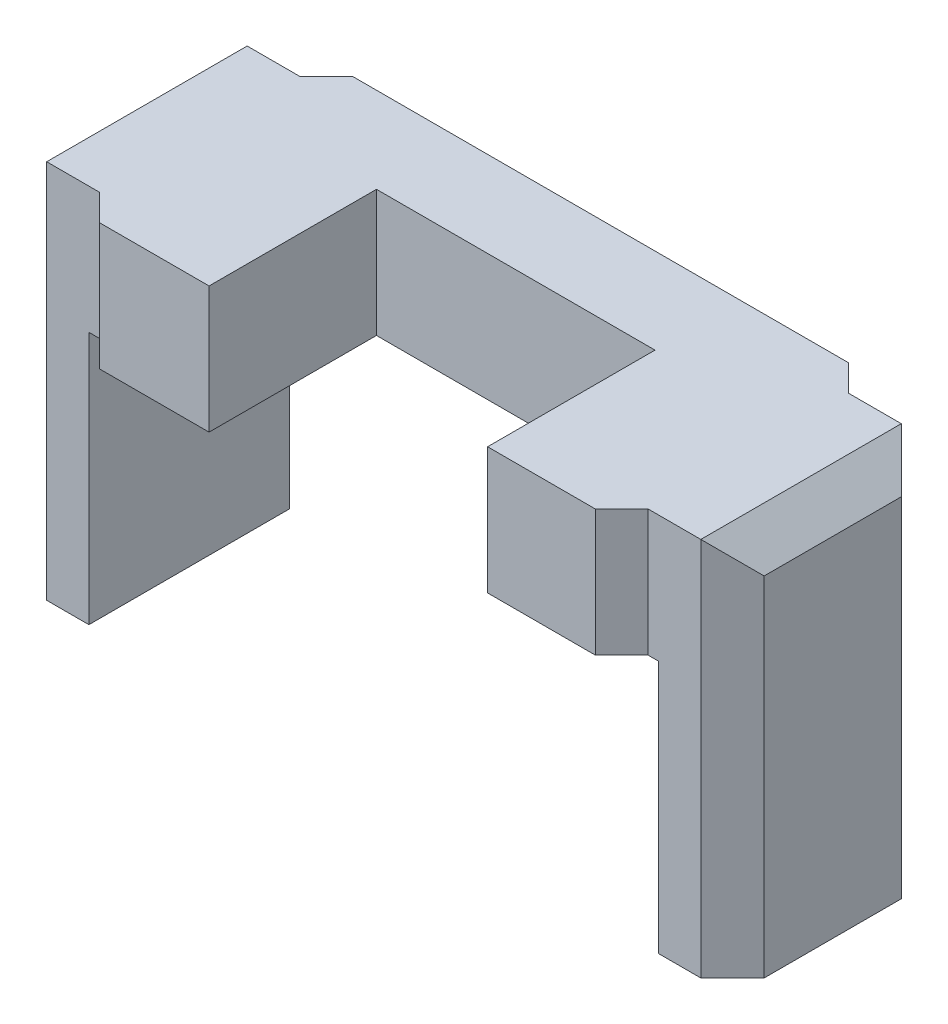
ISO-10303-21;
HEADER;
FILE_DESCRIPTION(('STEP AP214'),'2;1');
FILE_NAME('part.step','',(''),(''),'','','');
FILE_SCHEMA(('AUTOMOTIVE_DESIGN { 1 0 10303 214 1 1 1 1 }'));
ENDSEC;
DATA;
#1=APPLICATION_CONTEXT('core data for automotive mechanical design processes');
#2=APPLICATION_PROTOCOL_DEFINITION('international standard','automotive_design',2000,#1);
#3=PRODUCT_CONTEXT('',#1,'mechanical');
#4=PRODUCT('Part','Part','',(#3));
#5=PRODUCT_RELATED_PRODUCT_CATEGORY('part','',(#4));
#6=PRODUCT_DEFINITION_FORMATION('','',#4);
#7=PRODUCT_DEFINITION_CONTEXT('part definition',#1,'design');
#8=PRODUCT_DEFINITION('design','',#6,#7);
#9=PRODUCT_DEFINITION_SHAPE('','',#8);
#10=(LENGTH_UNIT() NAMED_UNIT(*) SI_UNIT(.MILLI.,.METRE.));
#11=(NAMED_UNIT(*) PLANE_ANGLE_UNIT() SI_UNIT($,.RADIAN.));
#12=(NAMED_UNIT(*) SI_UNIT($,.STERADIAN.) SOLID_ANGLE_UNIT());
#13=UNCERTAINTY_MEASURE_WITH_UNIT(LENGTH_MEASURE(1.E-05),#10,'distance_accuracy_value','');
#14=(GEOMETRIC_REPRESENTATION_CONTEXT(3) GLOBAL_UNCERTAINTY_ASSIGNED_CONTEXT((#13)) GLOBAL_UNIT_ASSIGNED_CONTEXT((#10,
#11,#12)) REPRESENTATION_CONTEXT('',''));
#15=CARTESIAN_POINT('',(0.,0.,0.));
#16=DIRECTION('',(0.,0.,1.));
#17=DIRECTION('',(1.,0.,0.));
#18=AXIS2_PLACEMENT_3D('',#15,#16,#17);
#19=CARTESIAN_POINT('',(-26.,12.,12.));
#20=DIRECTION('',(0.,0.,-1.));
#21=DIRECTION('',(-1.,0.,0.));
#22=AXIS2_PLACEMENT_3D('',#19,#20,#21);
#23=PLANE('',#22);
#24=DIRECTION('',(1.,0.,0.));
#25=VECTOR('',#24,1.);
#26=CARTESIAN_POINT('',(-26.,12.,12.));
#27=LINE('',#26,#25);
#28=CARTESIAN_POINT('',(13.2891625366929,12.,12.));
#29=VERTEX_POINT('',#28);
#30=CARTESIAN_POINT('',(23.5,12.,12.));
#31=VERTEX_POINT('',#30);
#32=EDGE_CURVE('E297',#29,#31,#27,.T.);
#33=ORIENTED_EDGE('',*,*,#32,.F.);
#34=DIRECTION('',(0.,-1.,0.));
#35=VECTOR('',#34,1.);
#36=CARTESIAN_POINT('',(13.2891625366929,12.,12.));
#37=LINE('',#36,#35);
#38=CARTESIAN_POINT('',(13.2891625366929,0.,12.));
#39=VERTEX_POINT('',#38);
#40=EDGE_CURVE('E54',#29,#39,#37,.T.);
#41=ORIENTED_EDGE('',*,*,#40,.T.);
#42=DIRECTION('',(1.,0.,0.));
#43=VECTOR('',#42,1.);
#44=CARTESIAN_POINT('',(-26.,0.,12.));
#45=LINE('',#44,#43);
#46=CARTESIAN_POINT('',(23.5,0.,12.));
#47=VERTEX_POINT('',#46);
#48=EDGE_CURVE('E305',#39,#47,#45,.T.);
#49=ORIENTED_EDGE('',*,*,#48,.T.);
#50=DIRECTION('',(0.,1.,0.));
#51=VECTOR('',#50,1.);
#52=CARTESIAN_POINT('',(23.5,12.,12.));
#53=LINE('',#52,#51);
#54=EDGE_CURVE('E326',#47,#31,#53,.T.);
#55=ORIENTED_EDGE('',*,*,#54,.T.);
#56=EDGE_LOOP('',(#33,#41,#49,#55));
#57=FACE_BOUND('',#56,.T.);
#58=ADVANCED_FACE('F45',(#57),#23,.F.);
#59=CARTESIAN_POINT('',(0.,0.,0.));
#60=DIRECTION('',(0.,1.,0.));
#61=DIRECTION('',(0.,0.,1.));
#62=AXIS2_PLACEMENT_3D('',#59,#60,#61);
#63=PLANE('',#62);
#64=ORIENTED_EDGE('',*,*,#48,.F.);
#65=DIRECTION('',(0.,0.,1.));
#66=VECTOR('',#65,1.);
#67=CARTESIAN_POINT('',(13.2891625366929,0.,-3.86635558878568));
#68=LINE('',#67,#66);
#69=CARTESIAN_POINT('',(13.2891625366929,0.,-3.86635558878568));
#70=VERTEX_POINT('',#69);
#71=EDGE_CURVE('E224',#70,#39,#68,.T.);
#72=ORIENTED_EDGE('',*,*,#71,.F.);
#73=DIRECTION('',(1.,0.,0.));
#74=VECTOR('',#73,1.);
#75=CARTESIAN_POINT('',(-13.1098322322012,0.,-3.86635558878567));
#76=LINE('',#75,#74);
#77=CARTESIAN_POINT('',(-13.1098322322012,0.,-3.86635558878567));
#78=VERTEX_POINT('',#77);
#79=EDGE_CURVE('E212',#78,#70,#76,.T.);
#80=ORIENTED_EDGE('',*,*,#79,.F.);
#81=DIRECTION('',(0.,0.,-1.));
#82=VECTOR('',#81,1.);
#83=CARTESIAN_POINT('',(-13.1098322322012,0.,12.1336444112143));
#84=LINE('',#83,#82);
#85=CARTESIAN_POINT('',(-13.1098322322012,0.,12.));
#86=VERTEX_POINT('',#85);
#87=EDGE_CURVE('E218',#86,#78,#84,.T.);
#88=ORIENTED_EDGE('',*,*,#87,.F.);
#89=CARTESIAN_POINT('',(-23.5,0.,12.));
#90=VERTEX_POINT('',#89);
#91=EDGE_CURVE('E298',#90,#86,#45,.T.);
#92=ORIENTED_EDGE('',*,*,#91,.F.);
#93=DIRECTION('',(0.707106781186548,0.,0.707106781186548));
#94=VECTOR('',#93,1.);
#95=CARTESIAN_POINT('',(-23.5,0.,12.));
#96=LINE('',#95,#94);
#97=CARTESIAN_POINT('',(-26.,0.,9.5));
#98=VERTEX_POINT('',#97);
#99=EDGE_CURVE('E312',#90,#98,#96,.F.);
#100=ORIENTED_EDGE('',*,*,#99,.T.);
#101=DIRECTION('',(1.,0.,0.));
#102=VECTOR('',#101,1.);
#103=CARTESIAN_POINT('',(-34.,0.,9.5));
#104=LINE('',#103,#102);
#105=CARTESIAN_POINT('',(-27.,0.,9.5));
#106=VERTEX_POINT('',#105);
#107=EDGE_CURVE('E285',#106,#98,#104,.T.);
#108=ORIENTED_EDGE('',*,*,#107,.F.);
#109=DIRECTION('',(0.,0.,1.));
#110=VECTOR('',#109,1.);
#111=CARTESIAN_POINT('',(-27.,0.,-9.49999999999999));
#112=LINE('',#111,#110);
#113=CARTESIAN_POINT('',(-27.,0.,-9.49999999999999));
#114=VERTEX_POINT('',#113);
#115=EDGE_CURVE('E268',#114,#106,#112,.T.);
#116=ORIENTED_EDGE('',*,*,#115,.F.);
#117=DIRECTION('',(1.,0.,0.));
#118=VECTOR('',#117,1.);
#119=CARTESIAN_POINT('',(-34.,0.,-9.49999999999999));
#120=LINE('',#119,#118);
#121=CARTESIAN_POINT('',(-26.,0.,-9.49999999999999));
#122=VERTEX_POINT('',#121);
#123=EDGE_CURVE('E287',#114,#122,#120,.T.);
#124=ORIENTED_EDGE('',*,*,#123,.T.);
#125=DIRECTION('',(-0.707106781186547,0.,0.707106781186549));
#126=VECTOR('',#125,1.);
#127=CARTESIAN_POINT('',(-26.,0.,-9.49999999999999));
#128=LINE('',#127,#126);
#129=CARTESIAN_POINT('',(-23.5,0.,-12.));
#130=VERTEX_POINT('',#129);
#131=EDGE_CURVE('E315',#122,#130,#128,.F.);
#132=ORIENTED_EDGE('',*,*,#131,.T.);
#133=DIRECTION('',(-1.,0.,0.));
#134=VECTOR('',#133,1.);
#135=CARTESIAN_POINT('',(-26.,0.,-12.));
#136=LINE('',#135,#134);
#137=CARTESIAN_POINT('',(23.5,0.,-12.));
#138=VERTEX_POINT('',#137);
#139=EDGE_CURVE('E293',#138,#130,#136,.T.);
#140=ORIENTED_EDGE('',*,*,#139,.F.);
#141=DIRECTION('',(-0.707106781186546,0.,-0.707106781186549));
#142=VECTOR('',#141,1.);
#143=CARTESIAN_POINT('',(23.5,0.,-12.));
#144=LINE('',#143,#142);
#145=CARTESIAN_POINT('',(26.,0.,-9.49999999999999));
#146=VERTEX_POINT('',#145);
#147=EDGE_CURVE('E317',#138,#146,#144,.F.);
#148=ORIENTED_EDGE('',*,*,#147,.T.);
#149=DIRECTION('',(-1.,0.,0.));
#150=VECTOR('',#149,1.);
#151=CARTESIAN_POINT('',(34.,0.,-9.49999999999999));
#152=LINE('',#151,#150);
#153=CARTESIAN_POINT('',(27.,0.,-9.49999999999999));
#154=VERTEX_POINT('',#153);
#155=EDGE_CURVE('E259',#154,#146,#152,.T.);
#156=ORIENTED_EDGE('',*,*,#155,.F.);
#157=DIRECTION('',(0.,0.,1.));
#158=VECTOR('',#157,1.);
#159=CARTESIAN_POINT('',(27.,0.,-9.49999999999999));
#160=LINE('',#159,#158);
#161=CARTESIAN_POINT('',(27.,0.,9.5));
#162=VERTEX_POINT('',#161);
#163=EDGE_CURVE('E240',#154,#162,#160,.T.);
#164=ORIENTED_EDGE('',*,*,#163,.T.);
#165=DIRECTION('',(-1.,0.,0.));
#166=VECTOR('',#165,1.);
#167=CARTESIAN_POINT('',(34.,0.,9.5));
#168=LINE('',#167,#166);
#169=CARTESIAN_POINT('',(26.,0.,9.49999999999999));
#170=VERTEX_POINT('',#169);
#171=EDGE_CURVE('E261',#162,#170,#168,.T.);
#172=ORIENTED_EDGE('',*,*,#171,.T.);
#173=DIRECTION('',(0.707106781186547,0.,-0.707106781186548));
#174=VECTOR('',#173,1.);
#175=CARTESIAN_POINT('',(26.,0.,9.49999999999999));
#176=LINE('',#175,#174);
#177=EDGE_CURVE('E320',#170,#47,#176,.F.);
#178=ORIENTED_EDGE('',*,*,#177,.T.);
#179=EDGE_LOOP('',(#64,#72,#80,#88,#92,#100,#108,#116,#124,#132,#140,#148,#156,#164,#172,#178));
#180=FACE_BOUND('',#179,.T.);
#181=ADVANCED_FACE('F227',(#180),#63,.F.);
#182=CARTESIAN_POINT('',(-26.,12.,-12.));
#183=DIRECTION('',(0.,0.,1.));
#184=DIRECTION('',(1.,0.,0.));
#185=AXIS2_PLACEMENT_3D('',#182,#183,#184);
#186=PLANE('',#185);
#187=DIRECTION('',(0.,-1.,0.));
#188=VECTOR('',#187,1.);
#189=CARTESIAN_POINT('',(23.5,12.,-12.));
#190=LINE('',#189,#188);
#191=CARTESIAN_POINT('',(23.5,12.,-12.));
#192=VERTEX_POINT('',#191);
#193=EDGE_CURVE('E341',#192,#138,#190,.T.);
#194=ORIENTED_EDGE('',*,*,#193,.T.);
#195=ORIENTED_EDGE('',*,*,#139,.T.);
#196=DIRECTION('',(0.,1.,0.));
#197=VECTOR('',#196,1.);
#198=CARTESIAN_POINT('',(-23.5,12.,-12.));
#199=LINE('',#198,#197);
#200=CARTESIAN_POINT('',(-23.5,12.,-12.));
#201=VERTEX_POINT('',#200);
#202=EDGE_CURVE('E339',#130,#201,#199,.T.);
#203=ORIENTED_EDGE('',*,*,#202,.T.);
#204=DIRECTION('',(-1.,0.,0.));
#205=VECTOR('',#204,1.);
#206=CARTESIAN_POINT('',(-26.,12.,-12.));
#207=LINE('',#206,#205);
#208=EDGE_CURVE('E294',#192,#201,#207,.T.);
#209=ORIENTED_EDGE('',*,*,#208,.F.);
#210=EDGE_LOOP('',(#194,#195,#203,#209));
#211=FACE_BOUND('',#210,.T.);
#212=ADVANCED_FACE('F428',(#211),#186,.F.);
#213=CARTESIAN_POINT('',(0.,12.,0.));
#214=DIRECTION('',(0.,1.,0.));
#215=DIRECTION('',(0.,0.,1.));
#216=AXIS2_PLACEMENT_3D('',#213,#214,#215);
#217=PLANE('',#216);
#218=DIRECTION('',(0.,0.,-1.));
#219=VECTOR('',#218,1.);
#220=CARTESIAN_POINT('',(13.2891625366929,12.,0.));
#221=LINE('',#220,#219);
#222=CARTESIAN_POINT('',(13.2891625366929,12.,-3.86635558878568));
#223=VERTEX_POINT('',#222);
#224=EDGE_CURVE('E233',#29,#223,#221,.T.);
#225=ORIENTED_EDGE('',*,*,#224,.F.);
#226=ORIENTED_EDGE('',*,*,#32,.T.);
#227=DIRECTION('',(-0.707106781186547,0.,0.707106781186548));
#228=VECTOR('',#227,1.);
#229=CARTESIAN_POINT('',(17.75,12.,17.75));
#230=LINE('',#229,#228);
#231=CARTESIAN_POINT('',(26.,12.,9.49999999999999));
#232=VERTEX_POINT('',#231);
#233=EDGE_CURVE('E336',#31,#232,#230,.F.);
#234=ORIENTED_EDGE('',*,*,#233,.T.);
#235=DIRECTION('',(-1.,0.,0.));
#236=VECTOR('',#235,1.);
#237=CARTESIAN_POINT('',(34.,12.,9.5));
#238=LINE('',#237,#236);
#239=CARTESIAN_POINT('',(31.,12.,9.5));
#240=VERTEX_POINT('',#239);
#241=EDGE_CURVE('E255',#240,#232,#238,.T.);
#242=ORIENTED_EDGE('',*,*,#241,.F.);
#243=DIRECTION('',(0.,0.,-1.));
#244=VECTOR('',#243,1.);
#245=CARTESIAN_POINT('',(31.,12.,0.));
#246=LINE('',#245,#244);
#247=CARTESIAN_POINT('',(31.,12.,-9.49999999999999));
#248=VERTEX_POINT('',#247);
#249=EDGE_CURVE('E385',#240,#248,#246,.T.);
#250=ORIENTED_EDGE('',*,*,#249,.T.);
#251=DIRECTION('',(-1.,0.,0.));
#252=VECTOR('',#251,1.);
#253=CARTESIAN_POINT('',(34.,12.,-9.49999999999999));
#254=LINE('',#253,#252);
#255=CARTESIAN_POINT('',(26.,12.,-9.49999999999999));
#256=VERTEX_POINT('',#255);
#257=EDGE_CURVE('E257',#248,#256,#254,.T.);
#258=ORIENTED_EDGE('',*,*,#257,.T.);
#259=DIRECTION('',(0.707106781186546,0.,0.707106781186549));
#260=VECTOR('',#259,1.);
#261=CARTESIAN_POINT('',(17.75,12.,-17.75));
#262=LINE('',#261,#260);
#263=EDGE_CURVE('E334',#256,#192,#262,.F.);
#264=ORIENTED_EDGE('',*,*,#263,.T.);
#265=ORIENTED_EDGE('',*,*,#208,.T.);
#266=DIRECTION('',(0.707106781186547,0.,-0.707106781186549));
#267=VECTOR('',#266,1.);
#268=CARTESIAN_POINT('',(-17.75,12.,-17.75));
#269=LINE('',#268,#267);
#270=CARTESIAN_POINT('',(-26.,12.,-9.49999999999999));
#271=VERTEX_POINT('',#270);
#272=EDGE_CURVE('E331',#201,#271,#269,.F.);
#273=ORIENTED_EDGE('',*,*,#272,.T.);
#274=DIRECTION('',(1.,0.,0.));
#275=VECTOR('',#274,1.);
#276=CARTESIAN_POINT('',(-34.,12.,-9.49999999999999));
#277=LINE('',#276,#275);
#278=CARTESIAN_POINT('',(-31.,12.,-9.49999999999999));
#279=VERTEX_POINT('',#278);
#280=EDGE_CURVE('E289',#279,#271,#277,.T.);
#281=ORIENTED_EDGE('',*,*,#280,.F.);
#282=DIRECTION('',(0.,0.,1.));
#283=VECTOR('',#282,1.);
#284=CARTESIAN_POINT('',(-31.,12.,0.));
#285=LINE('',#284,#283);
#286=CARTESIAN_POINT('',(-31.,12.,9.5));
#287=VERTEX_POINT('',#286);
#288=EDGE_CURVE('E365',#279,#287,#285,.T.);
#289=ORIENTED_EDGE('',*,*,#288,.T.);
#290=DIRECTION('',(1.,0.,0.));
#291=VECTOR('',#290,1.);
#292=CARTESIAN_POINT('',(-34.,12.,9.5));
#293=LINE('',#292,#291);
#294=CARTESIAN_POINT('',(-26.,12.,9.5));
#295=VERTEX_POINT('',#294);
#296=EDGE_CURVE('E291',#287,#295,#293,.T.);
#297=ORIENTED_EDGE('',*,*,#296,.T.);
#298=DIRECTION('',(-0.707106781186548,0.,-0.707106781186548));
#299=VECTOR('',#298,1.);
#300=CARTESIAN_POINT('',(-17.75,12.,17.75));
#301=LINE('',#300,#299);
#302=CARTESIAN_POINT('',(-23.5,12.,12.));
#303=VERTEX_POINT('',#302);
#304=EDGE_CURVE('E329',#295,#303,#301,.F.);
#305=ORIENTED_EDGE('',*,*,#304,.T.);
#306=CARTESIAN_POINT('',(-13.1098322322012,12.,12.));
#307=VERTEX_POINT('',#306);
#308=EDGE_CURVE('E299',#303,#307,#27,.T.);
#309=ORIENTED_EDGE('',*,*,#308,.T.);
#310=DIRECTION('',(0.,0.,1.));
#311=VECTOR('',#310,1.);
#312=CARTESIAN_POINT('',(-13.1098322322012,12.,0.));
#313=LINE('',#312,#311);
#314=CARTESIAN_POINT('',(-13.1098322322012,12.,-3.86635558878567));
#315=VERTEX_POINT('',#314);
#316=EDGE_CURVE('E61',#315,#307,#313,.T.);
#317=ORIENTED_EDGE('',*,*,#316,.F.);
#318=DIRECTION('',(-1.,0.,0.));
#319=VECTOR('',#318,1.);
#320=CARTESIAN_POINT('',(0.,12.,-3.86635558878567));
#321=LINE('',#320,#319);
#322=EDGE_CURVE('E11',#223,#315,#321,.T.);
#323=ORIENTED_EDGE('',*,*,#322,.F.);
#324=EDGE_LOOP('',(#225,#226,#234,#242,#250,#258,#264,#265,#273,#281,#289,#297,#305,#309,#317,#323));
#325=FACE_BOUND('',#324,.T.);
#326=ADVANCED_FACE('F404',(#325),#217,.T.);
#327=ORIENTED_EDGE('',*,*,#91,.T.);
#328=DIRECTION('',(0.,1.,0.));
#329=VECTOR('',#328,1.);
#330=CARTESIAN_POINT('',(-13.1098322322012,12.,12.));
#331=LINE('',#330,#329);
#332=EDGE_CURVE('E220',#86,#307,#331,.T.);
#333=ORIENTED_EDGE('',*,*,#332,.T.);
#334=ORIENTED_EDGE('',*,*,#308,.F.);
#335=DIRECTION('',(0.,-1.,0.));
#336=VECTOR('',#335,1.);
#337=CARTESIAN_POINT('',(-23.5,12.,12.));
#338=LINE('',#337,#336);
#339=EDGE_CURVE('E323',#303,#90,#338,.T.);
#340=ORIENTED_EDGE('',*,*,#339,.T.);
#341=EDGE_LOOP('',(#327,#333,#334,#340));
#342=FACE_BOUND('',#341,.T.);
#343=ADVANCED_FACE('F423',(#342),#23,.F.);
#344=CARTESIAN_POINT('',(26.,12.,9.49999999999999));
#345=DIRECTION('',(-0.707106781186548,0.,-0.707106781186547));
#346=DIRECTION('',(0.,-1.,0.));
#347=AXIS2_PLACEMENT_3D('',#344,#345,#346);
#348=PLANE('',#347);
#349=ORIENTED_EDGE('',*,*,#233,.F.);
#350=ORIENTED_EDGE('',*,*,#54,.F.);
#351=ORIENTED_EDGE('',*,*,#177,.F.);
#352=DIRECTION('',(0.,-1.,0.));
#353=VECTOR('',#352,1.);
#354=CARTESIAN_POINT('',(26.,12.,9.49999999999999));
#355=LINE('',#354,#353);
#356=EDGE_CURVE('E309',#232,#170,#355,.T.);
#357=ORIENTED_EDGE('',*,*,#356,.F.);
#358=EDGE_LOOP('',(#349,#350,#351,#357));
#359=FACE_BOUND('',#358,.T.);
#360=ADVANCED_FACE('F402',(#359),#348,.F.);
#361=CARTESIAN_POINT('',(23.5,12.,-12.));
#362=DIRECTION('',(-0.707106781186549,0.,0.707106781186546));
#363=DIRECTION('',(0.,-1.,0.));
#364=AXIS2_PLACEMENT_3D('',#361,#362,#363);
#365=PLANE('',#364);
#366=ORIENTED_EDGE('',*,*,#263,.F.);
#367=DIRECTION('',(0.,1.,0.));
#368=VECTOR('',#367,1.);
#369=CARTESIAN_POINT('',(26.,12.,-9.49999999999999));
#370=LINE('',#369,#368);
#371=EDGE_CURVE('E302',#146,#256,#370,.T.);
#372=ORIENTED_EDGE('',*,*,#371,.F.);
#373=ORIENTED_EDGE('',*,*,#147,.F.);
#374=ORIENTED_EDGE('',*,*,#193,.F.);
#375=EDGE_LOOP('',(#366,#372,#373,#374));
#376=FACE_BOUND('',#375,.T.);
#377=ADVANCED_FACE('F436',(#376),#365,.F.);
#378=CARTESIAN_POINT('',(-26.,12.,-9.49999999999999));
#379=DIRECTION('',(0.707106781186549,0.,0.707106781186547));
#380=DIRECTION('',(0.,-1.,0.));
#381=AXIS2_PLACEMENT_3D('',#378,#379,#380);
#382=PLANE('',#381);
#383=ORIENTED_EDGE('',*,*,#272,.F.);
#384=ORIENTED_EDGE('',*,*,#202,.F.);
#385=ORIENTED_EDGE('',*,*,#131,.F.);
#386=DIRECTION('',(0.,-1.,0.));
#387=VECTOR('',#386,1.);
#388=CARTESIAN_POINT('',(-26.,12.,-9.49999999999999));
#389=LINE('',#388,#387);
#390=EDGE_CURVE('E347',#271,#122,#389,.T.);
#391=ORIENTED_EDGE('',*,*,#390,.F.);
#392=EDGE_LOOP('',(#383,#384,#385,#391));
#393=FACE_BOUND('',#392,.T.);
#394=ADVANCED_FACE('F464',(#393),#382,.F.);
#395=CARTESIAN_POINT('',(-23.5,12.,12.));
#396=DIRECTION('',(0.707106781186547,0.,-0.707106781186547));
#397=DIRECTION('',(0.,-1.,0.));
#398=AXIS2_PLACEMENT_3D('',#395,#396,#397);
#399=PLANE('',#398);
#400=ORIENTED_EDGE('',*,*,#304,.F.);
#401=DIRECTION('',(0.,1.,0.));
#402=VECTOR('',#401,1.);
#403=CARTESIAN_POINT('',(-26.,12.,9.5));
#404=LINE('',#403,#402);
#405=EDGE_CURVE('E344',#98,#295,#404,.T.);
#406=ORIENTED_EDGE('',*,*,#405,.F.);
#407=ORIENTED_EDGE('',*,*,#99,.F.);
#408=ORIENTED_EDGE('',*,*,#339,.F.);
#409=EDGE_LOOP('',(#400,#406,#407,#408));
#410=FACE_BOUND('',#409,.T.);
#411=ADVANCED_FACE('F445',(#410),#399,.F.);
#412=CARTESIAN_POINT('',(-34.,0.,9.5));
#413=DIRECTION('',(0.,0.,-1.));
#414=DIRECTION('',(-1.,0.,0.));
#415=AXIS2_PLACEMENT_3D('',#412,#413,#414);
#416=PLANE('',#415);
#417=DIRECTION('',(0.,1.,0.));
#418=VECTOR('',#417,1.);
#419=CARTESIAN_POINT('',(-27.,-24.,9.5));
#420=LINE('',#419,#418);
#421=CARTESIAN_POINT('',(-27.,-24.,9.5));
#422=VERTEX_POINT('',#421);
#423=EDGE_CURVE('E282',#422,#106,#420,.T.);
#424=ORIENTED_EDGE('',*,*,#423,.T.);
#425=ORIENTED_EDGE('',*,*,#107,.T.);
#426=ORIENTED_EDGE('',*,*,#405,.T.);
#427=ORIENTED_EDGE('',*,*,#296,.F.);
#428=DIRECTION('',(0.,-1.,0.));
#429=VECTOR('',#428,1.);
#430=CARTESIAN_POINT('',(-31.,-24.,9.5));
#431=LINE('',#430,#429);
#432=CARTESIAN_POINT('',(-31.,-24.,9.5));
#433=VERTEX_POINT('',#432);
#434=EDGE_CURVE('E363',#287,#433,#431,.T.);
#435=ORIENTED_EDGE('',*,*,#434,.T.);
#436=DIRECTION('',(-1.,0.,0.));
#437=VECTOR('',#436,1.);
#438=CARTESIAN_POINT('',(-27.,-24.,9.5));
#439=LINE('',#438,#437);
#440=EDGE_CURVE('E267',#422,#433,#439,.T.);
#441=ORIENTED_EDGE('',*,*,#440,.F.);
#442=EDGE_LOOP('',(#424,#425,#426,#427,#435,#441));
#443=FACE_BOUND('',#442,.T.);
#444=ADVANCED_FACE('F448',(#443),#416,.F.);
#445=CARTESIAN_POINT('',(-34.,12.,-9.49999999999999));
#446=DIRECTION('',(0.,0.,1.));
#447=DIRECTION('',(1.,0.,0.));
#448=AXIS2_PLACEMENT_3D('',#445,#446,#447);
#449=PLANE('',#448);
#450=ORIENTED_EDGE('',*,*,#280,.T.);
#451=ORIENTED_EDGE('',*,*,#390,.T.);
#452=ORIENTED_EDGE('',*,*,#123,.F.);
#453=DIRECTION('',(0.,1.,0.));
#454=VECTOR('',#453,1.);
#455=CARTESIAN_POINT('',(-27.,-24.,-9.49999999999999));
#456=LINE('',#455,#454);
#457=CARTESIAN_POINT('',(-27.,-24.,-9.49999999999999));
#458=VERTEX_POINT('',#457);
#459=EDGE_CURVE('E276',#458,#114,#456,.T.);
#460=ORIENTED_EDGE('',*,*,#459,.F.);
#461=DIRECTION('',(1.,0.,0.));
#462=VECTOR('',#461,1.);
#463=CARTESIAN_POINT('',(-34.,-24.,-9.49999999999999));
#464=LINE('',#463,#462);
#465=CARTESIAN_POINT('',(-31.,-24.,-9.49999999999999));
#466=VERTEX_POINT('',#465);
#467=EDGE_CURVE('E274',#466,#458,#464,.T.);
#468=ORIENTED_EDGE('',*,*,#467,.F.);
#469=DIRECTION('',(0.,1.,0.));
#470=VECTOR('',#469,1.);
#471=CARTESIAN_POINT('',(-31.,12.,-9.49999999999999));
#472=LINE('',#471,#470);
#473=EDGE_CURVE('E361',#466,#279,#472,.T.);
#474=ORIENTED_EDGE('',*,*,#473,.T.);
#475=EDGE_LOOP('',(#450,#451,#452,#460,#468,#474));
#476=FACE_BOUND('',#475,.T.);
#477=ADVANCED_FACE('F458',(#476),#449,.F.);
#478=CARTESIAN_POINT('',(-34.,0.,0.));
#479=DIRECTION('',(-1.,0.,0.));
#480=DIRECTION('',(0.,0.,1.));
#481=AXIS2_PLACEMENT_3D('',#478,#479,#480);
#482=PLANE('',#481);
#483=DIRECTION('',(0.,0.,-1.));
#484=VECTOR('',#483,1.);
#485=CARTESIAN_POINT('',(-34.,9.,0.));
#486=LINE('',#485,#484);
#487=CARTESIAN_POINT('',(-34.,9.,6.5));
#488=VERTEX_POINT('',#487);
#489=CARTESIAN_POINT('',(-34.,9.,-6.49999999999998));
#490=VERTEX_POINT('',#489);
#491=EDGE_CURVE('E350',#488,#490,#486,.T.);
#492=ORIENTED_EDGE('',*,*,#491,.T.);
#493=DIRECTION('',(0.,-1.,0.));
#494=VECTOR('',#493,1.);
#495=CARTESIAN_POINT('',(-34.,-24.,-6.49999999999998));
#496=LINE('',#495,#494);
#497=CARTESIAN_POINT('',(-34.,-24.,-6.49999999999998));
#498=VERTEX_POINT('',#497);
#499=EDGE_CURVE('E354',#490,#498,#496,.T.);
#500=ORIENTED_EDGE('',*,*,#499,.T.);
#501=DIRECTION('',(0.,0.,-1.));
#502=VECTOR('',#501,1.);
#503=CARTESIAN_POINT('',(-34.,-24.,9.5));
#504=LINE('',#503,#502);
#505=CARTESIAN_POINT('',(-34.,-24.,6.5));
#506=VERTEX_POINT('',#505);
#507=EDGE_CURVE('E271',#506,#498,#504,.T.);
#508=ORIENTED_EDGE('',*,*,#507,.F.);
#509=DIRECTION('',(0.,1.,0.));
#510=VECTOR('',#509,1.);
#511=CARTESIAN_POINT('',(-34.,12.,6.5));
#512=LINE('',#511,#510);
#513=EDGE_CURVE('E352',#506,#488,#512,.T.);
#514=ORIENTED_EDGE('',*,*,#513,.T.);
#515=EDGE_LOOP('',(#492,#500,#508,#514));
#516=FACE_BOUND('',#515,.T.);
#517=ADVANCED_FACE('F517',(#516),#482,.T.);
#518=CARTESIAN_POINT('',(-27.,-24.,-9.49999999999999));
#519=DIRECTION('',(-1.,0.,0.));
#520=DIRECTION('',(0.,0.,1.));
#521=AXIS2_PLACEMENT_3D('',#518,#519,#520);
#522=PLANE('',#521);
#523=ORIENTED_EDGE('',*,*,#115,.T.);
#524=ORIENTED_EDGE('',*,*,#423,.F.);
#525=DIRECTION('',(0.,0.,1.));
#526=VECTOR('',#525,1.);
#527=CARTESIAN_POINT('',(-27.,-24.,-9.49999999999999));
#528=LINE('',#527,#526);
#529=EDGE_CURVE('E264',#458,#422,#528,.T.);
#530=ORIENTED_EDGE('',*,*,#529,.F.);
#531=ORIENTED_EDGE('',*,*,#459,.T.);
#532=EDGE_LOOP('',(#523,#524,#530,#531));
#533=FACE_BOUND('',#532,.T.);
#534=ADVANCED_FACE('F453',(#533),#522,.F.);
#535=CARTESIAN_POINT('',(0.,-24.,0.));
#536=DIRECTION('',(0.,-1.,0.));
#537=DIRECTION('',(0.,0.,-1.));
#538=AXIS2_PLACEMENT_3D('',#535,#536,#537);
#539=PLANE('',#538);
#540=ORIENTED_EDGE('',*,*,#507,.T.);
#541=DIRECTION('',(0.707106781186548,0.,-0.707106781186547));
#542=VECTOR('',#541,1.);
#543=CARTESIAN_POINT('',(-20.25,-24.,-20.25));
#544=LINE('',#543,#542);
#545=EDGE_CURVE('E359',#498,#466,#544,.T.);
#546=ORIENTED_EDGE('',*,*,#545,.T.);
#547=ORIENTED_EDGE('',*,*,#467,.T.);
#548=ORIENTED_EDGE('',*,*,#529,.T.);
#549=ORIENTED_EDGE('',*,*,#440,.T.);
#550=DIRECTION('',(-0.707106781186549,0.,-0.707106781186546));
#551=VECTOR('',#550,1.);
#552=CARTESIAN_POINT('',(-20.2499999999999,-24.,20.25));
#553=LINE('',#552,#551);
#554=EDGE_CURVE('E357',#433,#506,#553,.T.);
#555=ORIENTED_EDGE('',*,*,#554,.T.);
#556=EDGE_LOOP('',(#540,#546,#547,#548,#549,#555));
#557=FACE_BOUND('',#556,.T.);
#558=ADVANCED_FACE('F510',(#557),#539,.T.);
#559=CARTESIAN_POINT('',(-34.,0.,6.5));
#560=DIRECTION('',(-0.707106781186546,0.,0.707106781186549));
#561=DIRECTION('',(0.,-1.,0.));
#562=AXIS2_PLACEMENT_3D('',#559,#560,#561);
#563=PLANE('',#562);
#564=ORIENTED_EDGE('',*,*,#554,.F.);
#565=ORIENTED_EDGE('',*,*,#434,.F.);
#566=DIRECTION('',(-0.577350269189628,-0.577350269189625,-0.577350269189625));
#567=VECTOR('',#566,1.);
#568=CARTESIAN_POINT('',(-36.1666666666667,6.83333333333334,4.33333333333335));
#569=LINE('',#568,#567);
#570=EDGE_CURVE('E279',#488,#287,#569,.F.);
#571=ORIENTED_EDGE('',*,*,#570,.F.);
#572=ORIENTED_EDGE('',*,*,#513,.F.);
#573=EDGE_LOOP('',(#564,#565,#571,#572));
#574=FACE_BOUND('',#573,.T.);
#575=ADVANCED_FACE('F513',(#574),#563,.T.);
#576=CARTESIAN_POINT('',(-34.,9.,0.));
#577=DIRECTION('',(0.707106781186546,-0.707106781186549,0.));
#578=DIRECTION('',(0.,0.,-1.));
#579=AXIS2_PLACEMENT_3D('',#576,#577,#578);
#580=PLANE('',#579);
#581=ORIENTED_EDGE('',*,*,#570,.T.);
#582=ORIENTED_EDGE('',*,*,#288,.F.);
#583=DIRECTION('',(0.577350269189627,0.577350269189625,-0.577350269189626));
#584=VECTOR('',#583,1.);
#585=CARTESIAN_POINT('',(-36.1666666666667,6.83333333333334,-4.33333333333332));
#586=LINE('',#585,#584);
#587=EDGE_CURVE('E263',#490,#279,#586,.T.);
#588=ORIENTED_EDGE('',*,*,#587,.F.);
#589=ORIENTED_EDGE('',*,*,#491,.F.);
#590=EDGE_LOOP('',(#581,#582,#588,#589));
#591=FACE_BOUND('',#590,.T.);
#592=ADVANCED_FACE('F546',(#591),#580,.F.);
#593=CARTESIAN_POINT('',(-34.,0.,-6.49999999999998));
#594=DIRECTION('',(-0.707106781186547,0.,-0.707106781186548));
#595=DIRECTION('',(0.,1.,0.));
#596=AXIS2_PLACEMENT_3D('',#593,#594,#595);
#597=PLANE('',#596);
#598=ORIENTED_EDGE('',*,*,#587,.T.);
#599=ORIENTED_EDGE('',*,*,#473,.F.);
#600=ORIENTED_EDGE('',*,*,#545,.F.);
#601=ORIENTED_EDGE('',*,*,#499,.F.);
#602=EDGE_LOOP('',(#598,#599,#600,#601));
#603=FACE_BOUND('',#602,.T.);
#604=ADVANCED_FACE('F509',(#603),#597,.T.);
#605=CARTESIAN_POINT('',(34.,0.,9.5));
#606=DIRECTION('',(0.,0.,1.));
#607=DIRECTION('',(1.,0.,0.));
#608=AXIS2_PLACEMENT_3D('',#605,#606,#607);
#609=PLANE('',#608);
#610=ORIENTED_EDGE('',*,*,#241,.T.);
#611=ORIENTED_EDGE('',*,*,#356,.T.);
#612=ORIENTED_EDGE('',*,*,#171,.F.);
#613=DIRECTION('',(0.,1.,0.));
#614=VECTOR('',#613,1.);
#615=CARTESIAN_POINT('',(27.,-24.,9.5));
#616=LINE('',#615,#614);
#617=CARTESIAN_POINT('',(27.,-24.,9.5));
#618=VERTEX_POINT('',#617);
#619=EDGE_CURVE('E247',#618,#162,#616,.T.);
#620=ORIENTED_EDGE('',*,*,#619,.F.);
#621=DIRECTION('',(1.,0.,0.));
#622=VECTOR('',#621,1.);
#623=CARTESIAN_POINT('',(27.,-24.,9.5));
#624=LINE('',#623,#622);
#625=CARTESIAN_POINT('',(31.,-24.,9.5));
#626=VERTEX_POINT('',#625);
#627=EDGE_CURVE('E245',#618,#626,#624,.T.);
#628=ORIENTED_EDGE('',*,*,#627,.T.);
#629=DIRECTION('',(0.,1.,0.));
#630=VECTOR('',#629,1.);
#631=CARTESIAN_POINT('',(31.,0.,9.5));
#632=LINE('',#631,#630);
#633=EDGE_CURVE('E69',#626,#240,#632,.T.);
#634=ORIENTED_EDGE('',*,*,#633,.T.);
#635=EDGE_LOOP('',(#610,#611,#612,#620,#628,#634));
#636=FACE_BOUND('',#635,.T.);
#637=ADVANCED_FACE('F482',(#636),#609,.T.);
#638=CARTESIAN_POINT('',(34.,12.,-9.49999999999999));
#639=DIRECTION('',(0.,0.,-1.));
#640=DIRECTION('',(-1.,0.,0.));
#641=AXIS2_PLACEMENT_3D('',#638,#639,#640);
#642=PLANE('',#641);
#643=DIRECTION('',(0.,1.,0.));
#644=VECTOR('',#643,1.);
#645=CARTESIAN_POINT('',(27.,-24.,-9.49999999999999));
#646=LINE('',#645,#644);
#647=CARTESIAN_POINT('',(27.,-24.,-9.49999999999999));
#648=VERTEX_POINT('',#647);
#649=EDGE_CURVE('E252',#648,#154,#646,.T.);
#650=ORIENTED_EDGE('',*,*,#649,.T.);
#651=ORIENTED_EDGE('',*,*,#155,.T.);
#652=ORIENTED_EDGE('',*,*,#371,.T.);
#653=ORIENTED_EDGE('',*,*,#257,.F.);
#654=DIRECTION('',(0.,-1.,0.));
#655=VECTOR('',#654,1.);
#656=CARTESIAN_POINT('',(31.,12.,-9.49999999999999));
#657=LINE('',#656,#655);
#658=CARTESIAN_POINT('',(31.,-24.,-9.49999999999999));
#659=VERTEX_POINT('',#658);
#660=EDGE_CURVE('E367',#248,#659,#657,.T.);
#661=ORIENTED_EDGE('',*,*,#660,.T.);
#662=DIRECTION('',(-1.,0.,0.));
#663=VECTOR('',#662,1.);
#664=CARTESIAN_POINT('',(34.,-24.,-9.49999999999999));
#665=LINE('',#664,#663);
#666=EDGE_CURVE('E239',#659,#648,#665,.T.);
#667=ORIENTED_EDGE('',*,*,#666,.T.);
#668=EDGE_LOOP('',(#650,#651,#652,#653,#661,#667));
#669=FACE_BOUND('',#668,.T.);
#670=ADVANCED_FACE('F476',(#669),#642,.T.);
#671=CARTESIAN_POINT('',(34.,0.,0.));
#672=DIRECTION('',(1.,0.,0.));
#673=DIRECTION('',(0.,0.,1.));
#674=AXIS2_PLACEMENT_3D('',#671,#672,#673);
#675=PLANE('',#674);
#676=DIRECTION('',(0.,0.,-1.));
#677=VECTOR('',#676,1.);
#678=CARTESIAN_POINT('',(34.,-24.,9.5));
#679=LINE('',#678,#677);
#680=CARTESIAN_POINT('',(34.,-24.,6.5));
#681=VERTEX_POINT('',#680);
#682=CARTESIAN_POINT('',(34.,-24.,-6.49999999999998));
#683=VERTEX_POINT('',#682);
#684=EDGE_CURVE('E242',#681,#683,#679,.T.);
#685=ORIENTED_EDGE('',*,*,#684,.T.);
#686=DIRECTION('',(0.,1.,0.));
#687=VECTOR('',#686,1.);
#688=CARTESIAN_POINT('',(34.,0.,-6.49999999999998));
#689=LINE('',#688,#687);
#690=CARTESIAN_POINT('',(34.,9.,-6.49999999999998));
#691=VERTEX_POINT('',#690);
#692=EDGE_CURVE('E382',#683,#691,#689,.T.);
#693=ORIENTED_EDGE('',*,*,#692,.T.);
#694=DIRECTION('',(0.,0.,1.));
#695=VECTOR('',#694,1.);
#696=CARTESIAN_POINT('',(34.,9.,0.));
#697=LINE('',#696,#695);
#698=CARTESIAN_POINT('',(34.,9.,6.5));
#699=VERTEX_POINT('',#698);
#700=EDGE_CURVE('E378',#691,#699,#697,.T.);
#701=ORIENTED_EDGE('',*,*,#700,.T.);
#702=DIRECTION('',(0.,-1.,0.));
#703=VECTOR('',#702,1.);
#704=CARTESIAN_POINT('',(34.,0.,6.5));
#705=LINE('',#704,#703);
#706=EDGE_CURVE('E380',#699,#681,#705,.T.);
#707=ORIENTED_EDGE('',*,*,#706,.T.);
#708=EDGE_LOOP('',(#685,#693,#701,#707));
#709=FACE_BOUND('',#708,.T.);
#710=ADVANCED_FACE('F497',(#709),#675,.T.);
#711=CARTESIAN_POINT('',(27.,-24.,-9.49999999999999));
#712=DIRECTION('',(-1.,0.,0.));
#713=DIRECTION('',(0.,0.,1.));
#714=AXIS2_PLACEMENT_3D('',#711,#712,#713);
#715=PLANE('',#714);
#716=ORIENTED_EDGE('',*,*,#163,.F.);
#717=ORIENTED_EDGE('',*,*,#649,.F.);
#718=DIRECTION('',(0.,0.,1.));
#719=VECTOR('',#718,1.);
#720=CARTESIAN_POINT('',(27.,-24.,-9.49999999999999));
#721=LINE('',#720,#719);
#722=EDGE_CURVE('E236',#648,#618,#721,.T.);
#723=ORIENTED_EDGE('',*,*,#722,.T.);
#724=ORIENTED_EDGE('',*,*,#619,.T.);
#725=EDGE_LOOP('',(#716,#717,#723,#724));
#726=FACE_BOUND('',#725,.T.);
#727=ADVANCED_FACE('F480',(#726),#715,.T.);
#728=CARTESIAN_POINT('',(0.,-24.,0.));
#729=DIRECTION('',(0.,-1.,0.));
#730=DIRECTION('',(0.,0.,-1.));
#731=AXIS2_PLACEMENT_3D('',#728,#729,#730);
#732=PLANE('',#731);
#733=ORIENTED_EDGE('',*,*,#666,.F.);
#734=DIRECTION('',(-0.707106781186548,0.,-0.707106781186547));
#735=VECTOR('',#734,1.);
#736=CARTESIAN_POINT('',(20.25,-24.,-20.25));
#737=LINE('',#736,#735);
#738=EDGE_CURVE('E376',#659,#683,#737,.F.);
#739=ORIENTED_EDGE('',*,*,#738,.T.);
#740=ORIENTED_EDGE('',*,*,#684,.F.);
#741=DIRECTION('',(0.707106781186549,0.,-0.707106781186546));
#742=VECTOR('',#741,1.);
#743=CARTESIAN_POINT('',(20.2499999999999,-24.,20.25));
#744=LINE('',#743,#742);
#745=EDGE_CURVE('E374',#681,#626,#744,.F.);
#746=ORIENTED_EDGE('',*,*,#745,.T.);
#747=ORIENTED_EDGE('',*,*,#627,.F.);
#748=ORIENTED_EDGE('',*,*,#722,.F.);
#749=EDGE_LOOP('',(#733,#739,#740,#746,#747,#748));
#750=FACE_BOUND('',#749,.T.);
#751=ADVANCED_FACE('F493',(#750),#732,.T.);
#752=CARTESIAN_POINT('',(31.,0.,9.5));
#753=DIRECTION('',(-0.707106781186546,0.,-0.707106781186549));
#754=DIRECTION('',(0.,1.,0.));
#755=AXIS2_PLACEMENT_3D('',#752,#753,#754);
#756=PLANE('',#755);
#757=ORIENTED_EDGE('',*,*,#745,.F.);
#758=ORIENTED_EDGE('',*,*,#706,.F.);
#759=DIRECTION('',(0.577350269189628,-0.577350269189625,-0.577350269189625));
#760=VECTOR('',#759,1.);
#761=CARTESIAN_POINT('',(34.1666666666666,8.83333333333334,6.33333333333335));
#762=LINE('',#761,#760);
#763=EDGE_CURVE('E249',#240,#699,#762,.T.);
#764=ORIENTED_EDGE('',*,*,#763,.F.);
#765=ORIENTED_EDGE('',*,*,#633,.F.);
#766=EDGE_LOOP('',(#757,#758,#764,#765));
#767=FACE_BOUND('',#766,.T.);
#768=ADVANCED_FACE('F48',(#767),#756,.F.);
#769=CARTESIAN_POINT('',(31.,12.,0.));
#770=DIRECTION('',(-0.707106781186546,-0.707106781186549,0.));
#771=DIRECTION('',(0.,0.,-1.));
#772=AXIS2_PLACEMENT_3D('',#769,#770,#771);
#773=PLANE('',#772);
#774=ORIENTED_EDGE('',*,*,#763,.T.);
#775=ORIENTED_EDGE('',*,*,#700,.F.);
#776=DIRECTION('',(-0.577350269189627,0.577350269189625,-0.577350269189626));
#777=VECTOR('',#776,1.);
#778=CARTESIAN_POINT('',(34.1666666666667,8.83333333333334,-6.33333333333332));
#779=LINE('',#778,#777);
#780=EDGE_CURVE('E235',#248,#691,#779,.F.);
#781=ORIENTED_EDGE('',*,*,#780,.F.);
#782=ORIENTED_EDGE('',*,*,#249,.F.);
#783=EDGE_LOOP('',(#774,#775,#781,#782));
#784=FACE_BOUND('',#783,.T.);
#785=ADVANCED_FACE('F416',(#784),#773,.F.);
#786=CARTESIAN_POINT('',(31.,12.,-9.49999999999999));
#787=DIRECTION('',(-0.707106781186547,0.,0.707106781186548));
#788=DIRECTION('',(0.,-1.,0.));
#789=AXIS2_PLACEMENT_3D('',#786,#787,#788);
#790=PLANE('',#789);
#791=ORIENTED_EDGE('',*,*,#780,.T.);
#792=ORIENTED_EDGE('',*,*,#692,.F.);
#793=ORIENTED_EDGE('',*,*,#738,.F.);
#794=ORIENTED_EDGE('',*,*,#660,.F.);
#795=EDGE_LOOP('',(#791,#792,#793,#794));
#796=FACE_BOUND('',#795,.T.);
#797=ADVANCED_FACE('F408',(#796),#790,.F.);
#798=CARTESIAN_POINT('',(13.2891625366929,13.,-3.86635558878568));
#799=DIRECTION('',(1.,0.,0.));
#800=DIRECTION('',(0.,0.,-1.));
#801=AXIS2_PLACEMENT_3D('',#798,#799,#800);
#802=PLANE('',#801);
#803=ORIENTED_EDGE('',*,*,#224,.T.);
#804=DIRECTION('',(0.,-1.,0.));
#805=VECTOR('',#804,1.);
#806=CARTESIAN_POINT('',(13.2891625366929,13.,-3.86635558878568));
#807=LINE('',#806,#805);
#808=EDGE_CURVE('E215',#223,#70,#807,.T.);
#809=ORIENTED_EDGE('',*,*,#808,.T.);
#810=ORIENTED_EDGE('',*,*,#71,.T.);
#811=ORIENTED_EDGE('',*,*,#40,.F.);
#812=EDGE_LOOP('',(#803,#809,#810,#811));
#813=FACE_BOUND('',#812,.T.);
#814=ADVANCED_FACE('F406',(#813),#802,.F.);
#815=CARTESIAN_POINT('',(-13.1098322322012,13.,-3.86635558878567));
#816=DIRECTION('',(0.,0.,-1.));
#817=DIRECTION('',(-1.,0.,0.));
#818=AXIS2_PLACEMENT_3D('',#815,#816,#817);
#819=PLANE('',#818);
#820=ORIENTED_EDGE('',*,*,#322,.T.);
#821=DIRECTION('',(0.,-1.,0.));
#822=VECTOR('',#821,1.);
#823=CARTESIAN_POINT('',(-13.1098322322012,13.,-3.86635558878567));
#824=LINE('',#823,#822);
#825=EDGE_CURVE('E207',#315,#78,#824,.T.);
#826=ORIENTED_EDGE('',*,*,#825,.T.);
#827=ORIENTED_EDGE('',*,*,#79,.T.);
#828=ORIENTED_EDGE('',*,*,#808,.F.);
#829=EDGE_LOOP('',(#820,#826,#827,#828));
#830=FACE_BOUND('',#829,.T.);
#831=ADVANCED_FACE('F209',(#830),#819,.F.);
#832=CARTESIAN_POINT('',(-13.1098322322012,13.,12.1336444112143));
#833=DIRECTION('',(-1.,0.,0.));
#834=DIRECTION('',(0.,0.,1.));
#835=AXIS2_PLACEMENT_3D('',#832,#833,#834);
#836=PLANE('',#835);
#837=ORIENTED_EDGE('',*,*,#316,.T.);
#838=ORIENTED_EDGE('',*,*,#332,.F.);
#839=ORIENTED_EDGE('',*,*,#87,.T.);
#840=ORIENTED_EDGE('',*,*,#825,.F.);
#841=EDGE_LOOP('',(#837,#838,#839,#840));
#842=FACE_BOUND('',#841,.T.);
#843=ADVANCED_FACE('F219',(#842),#836,.F.);
#844=CLOSED_SHELL('',(#58,#181,#212,#326,#343,#360,#377,#394,#411,#444,#477,#517,#534,#558,#575,
#592,#604,#637,#670,#710,#727,#751,#768,#785,#797,#814,#831,#843));
#845=MANIFOLD_SOLID_BREP('B2',#844);
#846=ADVANCED_BREP_SHAPE_REPRESENTATION('',(#18,#845),#14);
#847=SHAPE_DEFINITION_REPRESENTATION(#9,#846);
ENDSEC;
END-ISO-10303-21;
